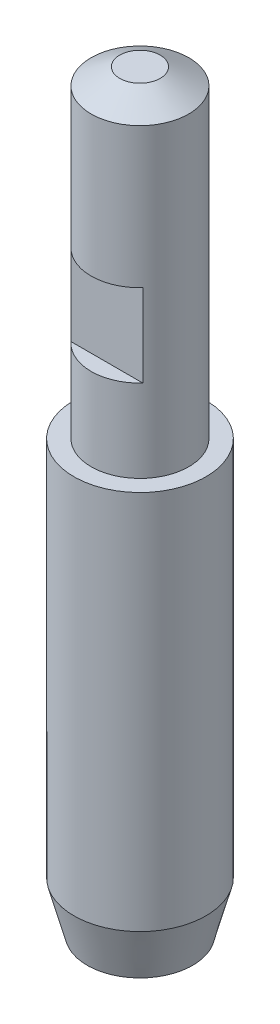
ISO-10303-21;
HEADER;
FILE_DESCRIPTION(('STEP AP214'),'2;1');
FILE_NAME('part.step','',(''),(''),'','','');
FILE_SCHEMA(('AUTOMOTIVE_DESIGN { 1 0 10303 214 1 1 1 1 }'));
ENDSEC;
DATA;
#1=APPLICATION_CONTEXT('core data for automotive mechanical design processes');
#2=APPLICATION_PROTOCOL_DEFINITION('international standard','automotive_design',2000,#1);
#3=PRODUCT_CONTEXT('',#1,'mechanical');
#4=PRODUCT('Part','Part','',(#3));
#5=PRODUCT_RELATED_PRODUCT_CATEGORY('part','',(#4));
#6=PRODUCT_DEFINITION_FORMATION('','',#4);
#7=PRODUCT_DEFINITION_CONTEXT('part definition',#1,'design');
#8=PRODUCT_DEFINITION('design','',#6,#7);
#9=PRODUCT_DEFINITION_SHAPE('','',#8);
#10=(LENGTH_UNIT() NAMED_UNIT(*) SI_UNIT(.MILLI.,.METRE.));
#11=(NAMED_UNIT(*) PLANE_ANGLE_UNIT() SI_UNIT($,.RADIAN.));
#12=(NAMED_UNIT(*) SI_UNIT($,.STERADIAN.) SOLID_ANGLE_UNIT());
#13=UNCERTAINTY_MEASURE_WITH_UNIT(LENGTH_MEASURE(1.E-05),#10,'distance_accuracy_value','');
#14=(GEOMETRIC_REPRESENTATION_CONTEXT(3) GLOBAL_UNCERTAINTY_ASSIGNED_CONTEXT((#13)) GLOBAL_UNIT_ASSIGNED_CONTEXT((#10,
#11,#12)) REPRESENTATION_CONTEXT('',''));
#15=CARTESIAN_POINT('',(0.,0.,0.));
#16=DIRECTION('',(0.,0.,1.));
#17=DIRECTION('',(1.,0.,0.));
#18=AXIS2_PLACEMENT_3D('',#15,#16,#17);
#19=CARTESIAN_POINT('',(0.,75.5253035120368,0.));
#20=DIRECTION('',(0.,1.,0.));
#21=DIRECTION('',(-1.,0.,0.));
#22=AXIS2_PLACEMENT_3D('',#19,#20,#21);
#23=PLANE('',#22);
#24=CARTESIAN_POINT('',(0.,75.5253035120368,0.));
#25=DIRECTION('',(0.,1.,0.));
#26=DIRECTION('',(-1.,0.,0.));
#27=AXIS2_PLACEMENT_3D('',#24,#25,#26);
#28=CIRCLE('',#27,1.22389565521861);
#29=CARTESIAN_POINT('',(-1.22389565521861,75.5253035120368,0.));
#30=VERTEX_POINT('',#29);
#31=EDGE_CURVE('E96',#30,#30,#28,.T.);
#32=ORIENTED_EDGE('',*,*,#31,.T.);
#33=EDGE_LOOP('',(#32));
#34=FACE_BOUND('',#33,.T.);
#35=ADVANCED_FACE('F33',(#34),#23,.T.);
#36=CARTESIAN_POINT('',(0.,75.5253035120368,0.));
#37=DIRECTION('',(0.,-1.,0.));
#38=DIRECTION('',(1.,0.,0.));
#39=AXIS2_PLACEMENT_3D('',#36,#37,#38);
#40=CONICAL_SURFACE('',#39,1.22389565521861,1.0471975511966);
#41=CARTESIAN_POINT('',(0.,74.5253035120368,0.));
#42=DIRECTION('',(0.,1.,0.));
#43=DIRECTION('',(-1.,0.,0.));
#44=AXIS2_PLACEMENT_3D('',#41,#42,#43);
#45=CIRCLE('',#44,2.95594646278748);
#46=CARTESIAN_POINT('',(-2.95594646278748,74.5253035120368,0.));
#47=VERTEX_POINT('',#46);
#48=EDGE_CURVE('E99',#47,#47,#45,.T.);
#49=ORIENTED_EDGE('',*,*,#48,.T.);
#50=EDGE_LOOP('',(#49));
#51=FACE_BOUND('',#50,.T.);
#52=ORIENTED_EDGE('',*,*,#31,.F.);
#53=EDGE_LOOP('',(#52));
#54=FACE_BOUND('',#53,.T.);
#55=ADVANCED_FACE('F137',(#51,#54),#40,.T.);
#56=CARTESIAN_POINT('',(0.,77.0951836190621,0.));
#57=DIRECTION('',(0.,1.,0.));
#58=DIRECTION('',(-1.,0.,0.));
#59=AXIS2_PLACEMENT_3D('',#56,#57,#58);
#60=CYLINDRICAL_SURFACE('',#59,2.95594646278749);
#61=CARTESIAN_POINT('',(0.,61.0253035120368,0.));
#62=DIRECTION('',(0.,-1.,0.));
#63=DIRECTION('',(0.,0.,-1.));
#64=AXIS2_PLACEMENT_3D('',#61,#62,#63);
#65=CIRCLE('',#64,2.95594646278749);
#66=CARTESIAN_POINT('',(2.17660733502072,61.0253035120368,-2.));
#67=VERTEX_POINT('',#66);
#68=CARTESIAN_POINT('',(-2.17660733502068,61.0253035120368,-2.));
#69=VERTEX_POINT('',#68);
#70=EDGE_CURVE('E11',#67,#69,#65,.F.);
#71=ORIENTED_EDGE('',*,*,#70,.F.);
#72=DIRECTION('',(0.,1.,0.));
#73=VECTOR('',#72,1.);
#74=CARTESIAN_POINT('',(2.1766073350207,77.0951836190621,-2.));
#75=LINE('',#74,#73);
#76=CARTESIAN_POINT('',(2.17660733502071,66.0253035120368,-2.));
#77=VERTEX_POINT('',#76);
#78=EDGE_CURVE('E40',#77,#67,#75,.F.);
#79=ORIENTED_EDGE('',*,*,#78,.F.);
#80=CARTESIAN_POINT('',(0.,66.0253035120368,0.));
#81=DIRECTION('',(0.,1.,0.));
#82=DIRECTION('',(0.,0.,1.));
#83=AXIS2_PLACEMENT_3D('',#80,#81,#82);
#84=CIRCLE('',#83,2.95594646278749);
#85=CARTESIAN_POINT('',(-2.17660733502068,66.0253035120368,-2.));
#86=VERTEX_POINT('',#85);
#87=EDGE_CURVE('E70',#86,#77,#84,.F.);
#88=ORIENTED_EDGE('',*,*,#87,.F.);
#89=DIRECTION('',(0.,1.,0.));
#90=VECTOR('',#89,1.);
#91=CARTESIAN_POINT('',(-2.1766073350207,77.0951836190621,-2.));
#92=LINE('',#91,#90);
#93=EDGE_CURVE('E75',#69,#86,#92,.T.);
#94=ORIENTED_EDGE('',*,*,#93,.F.);
#95=EDGE_LOOP('',(#71,#79,#88,#94));
#96=FACE_BOUND('',#95,.T.);
#97=CARTESIAN_POINT('',(0.,66.0253035120368,0.));
#98=DIRECTION('',(0.,1.,0.));
#99=DIRECTION('',(0.,0.,1.));
#100=AXIS2_PLACEMENT_3D('',#97,#98,#99);
#101=CIRCLE('',#100,2.95594646278749);
#102=CARTESIAN_POINT('',(2.17660733502071,66.0253035120368,2.));
#103=VERTEX_POINT('',#102);
#104=CARTESIAN_POINT('',(-2.17660733502068,66.0253035120368,2.));
#105=VERTEX_POINT('',#104);
#106=EDGE_CURVE('E76',#103,#105,#101,.F.);
#107=ORIENTED_EDGE('',*,*,#106,.F.);
#108=DIRECTION('',(0.,1.,0.));
#109=VECTOR('',#108,1.);
#110=CARTESIAN_POINT('',(2.1766073350207,77.0951836190621,2.));
#111=LINE('',#110,#109);
#112=CARTESIAN_POINT('',(2.17660733502072,61.0253035120368,2.));
#113=VERTEX_POINT('',#112);
#114=EDGE_CURVE('E92',#113,#103,#111,.T.);
#115=ORIENTED_EDGE('',*,*,#114,.F.);
#116=CARTESIAN_POINT('',(0.,61.0253035120368,0.));
#117=DIRECTION('',(0.,-1.,0.));
#118=DIRECTION('',(0.,0.,-1.));
#119=AXIS2_PLACEMENT_3D('',#116,#117,#118);
#120=CIRCLE('',#119,2.95594646278749);
#121=CARTESIAN_POINT('',(-2.17660733502068,61.0253035120368,2.));
#122=VERTEX_POINT('',#121);
#123=EDGE_CURVE('E94',#122,#113,#120,.F.);
#124=ORIENTED_EDGE('',*,*,#123,.F.);
#125=DIRECTION('',(0.,1.,0.));
#126=VECTOR('',#125,1.);
#127=CARTESIAN_POINT('',(-2.1766073350207,77.0951836190621,2.));
#128=LINE('',#127,#126);
#129=EDGE_CURVE('E90',#105,#122,#128,.F.);
#130=ORIENTED_EDGE('',*,*,#129,.F.);
#131=EDGE_LOOP('',(#107,#115,#124,#130));
#132=FACE_BOUND('',#131,.T.);
#133=CARTESIAN_POINT('',(0.,56.0253035120368,0.));
#134=DIRECTION('',(0.,1.,0.));
#135=DIRECTION('',(-1.,0.,0.));
#136=AXIS2_PLACEMENT_3D('',#133,#134,#135);
#137=CIRCLE('',#136,2.95594646278751);
#138=CARTESIAN_POINT('',(-2.95594646278748,56.0253035120368,0.));
#139=VERTEX_POINT('',#138);
#140=EDGE_CURVE('E102',#139,#139,#137,.T.);
#141=ORIENTED_EDGE('',*,*,#140,.T.);
#142=EDGE_LOOP('',(#141));
#143=FACE_BOUND('',#142,.T.);
#144=ORIENTED_EDGE('',*,*,#48,.F.);
#145=EDGE_LOOP('',(#144));
#146=FACE_BOUND('',#145,.T.);
#147=ADVANCED_FACE('F85',(#96,#132,#143,#146),#60,.T.);
#148=CARTESIAN_POINT('',(-4.,56.0253035120368,0.));
#149=DIRECTION('',(0.,1.,0.));
#150=DIRECTION('',(-1.,0.,0.));
#151=AXIS2_PLACEMENT_3D('',#148,#149,#150);
#152=PLANE('',#151);
#153=CARTESIAN_POINT('',(0.,56.0253035120368,0.));
#154=DIRECTION('',(0.,1.,0.));
#155=DIRECTION('',(-1.,0.,0.));
#156=AXIS2_PLACEMENT_3D('',#153,#154,#155);
#157=CIRCLE('',#156,4.00000000000002);
#158=CARTESIAN_POINT('',(-4.,56.0253035120368,0.));
#159=VERTEX_POINT('',#158);
#160=EDGE_CURVE('E105',#159,#159,#157,.T.);
#161=ORIENTED_EDGE('',*,*,#160,.T.);
#162=EDGE_LOOP('',(#161));
#163=FACE_BOUND('',#162,.T.);
#164=ORIENTED_EDGE('',*,*,#140,.F.);
#165=EDGE_LOOP('',(#164));
#166=FACE_BOUND('',#165,.T.);
#167=ADVANCED_FACE('F148',(#163,#166),#152,.T.);
#168=CARTESIAN_POINT('',(0.,77.0951836190621,0.));
#169=DIRECTION('',(0.,1.,0.));
#170=DIRECTION('',(-1.,0.,0.));
#171=AXIS2_PLACEMENT_3D('',#168,#169,#170);
#172=CYLINDRICAL_SURFACE('',#171,4.00000000000004);
#173=CARTESIAN_POINT('',(0.,33.,0.));
#174=DIRECTION('',(0.,1.,0.));
#175=DIRECTION('',(-1.,0.,0.));
#176=AXIS2_PLACEMENT_3D('',#173,#174,#175);
#177=CIRCLE('',#176,4.00000000000005);
#178=CARTESIAN_POINT('',(-3.99999999999999,33.,0.));
#179=VERTEX_POINT('',#178);
#180=EDGE_CURVE('E108',#179,#179,#177,.T.);
#181=ORIENTED_EDGE('',*,*,#180,.T.);
#182=EDGE_LOOP('',(#181));
#183=FACE_BOUND('',#182,.T.);
#184=ORIENTED_EDGE('',*,*,#160,.F.);
#185=EDGE_LOOP('',(#184));
#186=FACE_BOUND('',#185,.T.);
#187=ADVANCED_FACE('F153',(#183,#186),#172,.T.);
#188=CARTESIAN_POINT('',(0.,33.,0.));
#189=DIRECTION('',(0.,1.,0.));
#190=DIRECTION('',(-1.,0.,0.));
#191=AXIS2_PLACEMENT_3D('',#188,#189,#190);
#192=CONICAL_SURFACE('',#191,4.00000000000005,0.261799387799149);
#193=CARTESIAN_POINT('',(0.,30.,0.));
#194=DIRECTION('',(0.,1.,0.));
#195=DIRECTION('',(-1.,0.,0.));
#196=AXIS2_PLACEMENT_3D('',#193,#194,#195);
#197=CIRCLE('',#196,3.19615242270668);
#198=CARTESIAN_POINT('',(-3.19615242270662,30.,0.));
#199=VERTEX_POINT('',#198);
#200=EDGE_CURVE('E111',#199,#199,#197,.T.);
#201=ORIENTED_EDGE('',*,*,#200,.T.);
#202=EDGE_LOOP('',(#201));
#203=FACE_BOUND('',#202,.T.);
#204=ORIENTED_EDGE('',*,*,#180,.F.);
#205=EDGE_LOOP('',(#204));
#206=FACE_BOUND('',#205,.T.);
#207=ADVANCED_FACE('F157',(#203,#206),#192,.T.);
#208=CARTESIAN_POINT('',(0.,30.,0.));
#209=DIRECTION('',(0.,-1.,0.));
#210=DIRECTION('',(1.,0.,0.));
#211=AXIS2_PLACEMENT_3D('',#208,#209,#210);
#212=PLANE('',#211);
#213=CARTESIAN_POINT('',(0.,30.,0.));
#214=DIRECTION('',(0.,-1.,0.));
#215=DIRECTION('',(0.,0.,-1.));
#216=AXIS2_PLACEMENT_3D('',#213,#214,#215);
#217=CIRCLE('',#216,1.59999999999996);
#218=CARTESIAN_POINT('',(0.,30.,-1.59999999999996));
#219=VERTEX_POINT('',#218);
#220=EDGE_CURVE('E117',#219,#219,#217,.T.);
#221=ORIENTED_EDGE('',*,*,#220,.F.);
#222=EDGE_LOOP('',(#221));
#223=FACE_BOUND('',#222,.T.);
#224=ORIENTED_EDGE('',*,*,#200,.F.);
#225=EDGE_LOOP('',(#224));
#226=FACE_BOUND('',#225,.T.);
#227=ADVANCED_FACE('F161',(#223,#226),#212,.T.);
#228=CARTESIAN_POINT('',(0.,40.,0.));
#229=DIRECTION('',(0.,-1.,0.));
#230=DIRECTION('',(0.,0.,-1.));
#231=AXIS2_PLACEMENT_3D('',#228,#229,#230);
#232=CYLINDRICAL_SURFACE('',#231,1.59999999999996);
#233=CARTESIAN_POINT('',(0.,40.,0.));
#234=DIRECTION('',(0.,-1.,0.));
#235=DIRECTION('',(0.,0.,-1.));
#236=AXIS2_PLACEMENT_3D('',#233,#234,#235);
#237=CIRCLE('',#236,1.59999999999996);
#238=CARTESIAN_POINT('',(0.,40.,-1.59999999999996));
#239=VERTEX_POINT('',#238);
#240=EDGE_CURVE('E114',#239,#239,#237,.T.);
#241=ORIENTED_EDGE('',*,*,#240,.F.);
#242=EDGE_LOOP('',(#241));
#243=FACE_BOUND('',#242,.T.);
#244=ORIENTED_EDGE('',*,*,#220,.T.);
#245=EDGE_LOOP('',(#244));
#246=FACE_BOUND('',#245,.T.);
#247=ADVANCED_FACE('F165',(#243,#246),#232,.F.);
#248=CARTESIAN_POINT('',(0.,40.,0.));
#249=DIRECTION('',(0.,-1.,0.));
#250=DIRECTION('',(0.,0.,-1.));
#251=AXIS2_PLACEMENT_3D('',#248,#249,#250);
#252=PLANE('',#251);
#253=ORIENTED_EDGE('',*,*,#240,.T.);
#254=EDGE_LOOP('',(#253));
#255=FACE_BOUND('',#254,.T.);
#256=ADVANCED_FACE('F169',(#255),#252,.T.);
#257=CARTESIAN_POINT('',(-5.,66.0253035120368,4.23227980140873));
#258=DIRECTION('',(0.,1.,0.));
#259=DIRECTION('',(0.,0.,1.));
#260=AXIS2_PLACEMENT_3D('',#257,#258,#259);
#261=PLANE('',#260);
#262=ORIENTED_EDGE('',*,*,#106,.T.);
#263=DIRECTION('',(1.,0.,0.));
#264=VECTOR('',#263,1.);
#265=CARTESIAN_POINT('',(-5.,66.0253035120368,2.));
#266=LINE('',#265,#264);
#267=EDGE_CURVE('E120',#105,#103,#266,.T.);
#268=ORIENTED_EDGE('',*,*,#267,.T.);
#269=EDGE_LOOP('',(#262,#268));
#270=FACE_BOUND('',#269,.T.);
#271=ADVANCED_FACE('F172',(#270),#261,.F.);
#272=CARTESIAN_POINT('',(-5.,66.0253035120368,2.));
#273=DIRECTION('',(0.,0.,-1.));
#274=DIRECTION('',(0.,1.,0.));
#275=AXIS2_PLACEMENT_3D('',#272,#273,#274);
#276=PLANE('',#275);
#277=ORIENTED_EDGE('',*,*,#129,.T.);
#278=DIRECTION('',(1.,0.,0.));
#279=VECTOR('',#278,1.);
#280=CARTESIAN_POINT('',(-5.,61.0253035120368,2.));
#281=LINE('',#280,#279);
#282=EDGE_CURVE('E53',#122,#113,#281,.T.);
#283=ORIENTED_EDGE('',*,*,#282,.T.);
#284=ORIENTED_EDGE('',*,*,#114,.T.);
#285=ORIENTED_EDGE('',*,*,#267,.F.);
#286=EDGE_LOOP('',(#277,#283,#284,#285));
#287=FACE_BOUND('',#286,.T.);
#288=ADVANCED_FACE('F134',(#287),#276,.F.);
#289=CARTESIAN_POINT('',(-5.,61.0253035120368,4.23227980140873));
#290=DIRECTION('',(0.,-1.,0.));
#291=DIRECTION('',(0.,0.,-1.));
#292=AXIS2_PLACEMENT_3D('',#289,#290,#291);
#293=PLANE('',#292);
#294=ORIENTED_EDGE('',*,*,#123,.T.);
#295=ORIENTED_EDGE('',*,*,#282,.F.);
#296=EDGE_LOOP('',(#294,#295));
#297=FACE_BOUND('',#296,.T.);
#298=ADVANCED_FACE('F127',(#297),#293,.F.);
#299=CARTESIAN_POINT('',(-5.,61.0253035120368,-4.23227980140873));
#300=DIRECTION('',(0.,-1.,0.));
#301=DIRECTION('',(0.,0.,-1.));
#302=AXIS2_PLACEMENT_3D('',#299,#300,#301);
#303=PLANE('',#302);
#304=ORIENTED_EDGE('',*,*,#70,.T.);
#305=DIRECTION('',(1.,0.,0.));
#306=VECTOR('',#305,1.);
#307=CARTESIAN_POINT('',(-5.,61.0253035120368,-2.));
#308=LINE('',#307,#306);
#309=EDGE_CURVE('E82',#69,#67,#308,.T.);
#310=ORIENTED_EDGE('',*,*,#309,.T.);
#311=EDGE_LOOP('',(#304,#310));
#312=FACE_BOUND('',#311,.T.);
#313=ADVANCED_FACE('F125',(#312),#303,.F.);
#314=CARTESIAN_POINT('',(-5.,66.0253035120368,-2.));
#315=DIRECTION('',(0.,0.,1.));
#316=DIRECTION('',(0.,-1.,0.));
#317=AXIS2_PLACEMENT_3D('',#314,#315,#316);
#318=PLANE('',#317);
#319=ORIENTED_EDGE('',*,*,#78,.T.);
#320=ORIENTED_EDGE('',*,*,#309,.F.);
#321=ORIENTED_EDGE('',*,*,#93,.T.);
#322=DIRECTION('',(1.,0.,0.));
#323=VECTOR('',#322,1.);
#324=CARTESIAN_POINT('',(-5.,66.0253035120368,-2.));
#325=LINE('',#324,#323);
#326=EDGE_CURVE('E46',#86,#77,#325,.T.);
#327=ORIENTED_EDGE('',*,*,#326,.T.);
#328=EDGE_LOOP('',(#319,#320,#321,#327));
#329=FACE_BOUND('',#328,.T.);
#330=ADVANCED_FACE('F79',(#329),#318,.F.);
#331=CARTESIAN_POINT('',(-5.,66.0253035120368,-4.23227980140873));
#332=DIRECTION('',(0.,1.,0.));
#333=DIRECTION('',(0.,0.,1.));
#334=AXIS2_PLACEMENT_3D('',#331,#332,#333);
#335=PLANE('',#334);
#336=ORIENTED_EDGE('',*,*,#87,.T.);
#337=ORIENTED_EDGE('',*,*,#326,.F.);
#338=EDGE_LOOP('',(#336,#337));
#339=FACE_BOUND('',#338,.T.);
#340=ADVANCED_FACE('F71',(#339),#335,.F.);
#341=CLOSED_SHELL('',(#35,#55,#147,#167,#187,#207,#227,#247,#256,#271,#288,#298,#313,#330,#340));
#342=MANIFOLD_SOLID_BREP('B2',#341);
#343=ADVANCED_BREP_SHAPE_REPRESENTATION('',(#18,#342),#14);
#344=SHAPE_DEFINITION_REPRESENTATION(#9,#343);
ENDSEC;
END-ISO-10303-21;
